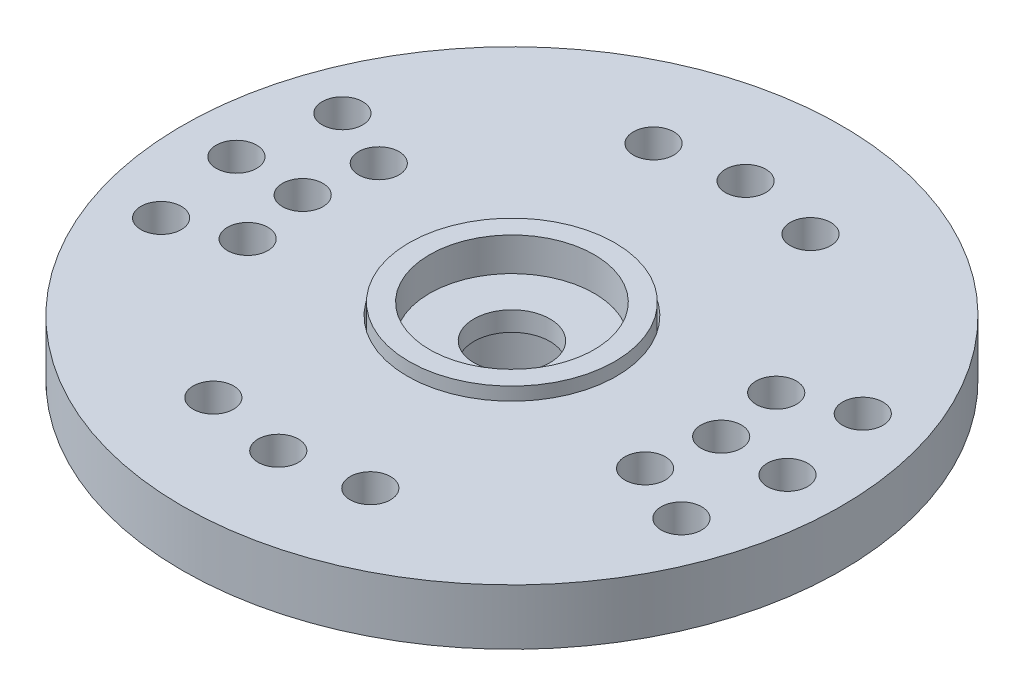
ISO-10303-21;
HEADER;
FILE_DESCRIPTION(('STEP AP214'),'2;1');
FILE_NAME('part.step','',(''),(''),'','','');
FILE_SCHEMA(('AUTOMOTIVE_DESIGN { 1 0 10303 214 1 1 1 1 }'));
ENDSEC;
DATA;
#1=APPLICATION_CONTEXT('core data for automotive mechanical design processes');
#2=APPLICATION_PROTOCOL_DEFINITION('international standard','automotive_design',2000,#1);
#3=PRODUCT_CONTEXT('',#1,'mechanical');
#4=PRODUCT('Part','Part','',(#3));
#5=PRODUCT_RELATED_PRODUCT_CATEGORY('part','',(#4));
#6=PRODUCT_DEFINITION_FORMATION('','',#4);
#7=PRODUCT_DEFINITION_CONTEXT('part definition',#1,'design');
#8=PRODUCT_DEFINITION('design','',#6,#7);
#9=PRODUCT_DEFINITION_SHAPE('','',#8);
#10=(LENGTH_UNIT() NAMED_UNIT(*) SI_UNIT(.MILLI.,.METRE.));
#11=(NAMED_UNIT(*) PLANE_ANGLE_UNIT() SI_UNIT($,.RADIAN.));
#12=(NAMED_UNIT(*) SI_UNIT($,.STERADIAN.) SOLID_ANGLE_UNIT());
#13=UNCERTAINTY_MEASURE_WITH_UNIT(LENGTH_MEASURE(1.E-05),#10,'distance_accuracy_value','');
#14=(GEOMETRIC_REPRESENTATION_CONTEXT(3) GLOBAL_UNCERTAINTY_ASSIGNED_CONTEXT((#13)) GLOBAL_UNIT_ASSIGNED_CONTEXT((#10,
#11,#12)) REPRESENTATION_CONTEXT('',''));
#15=CARTESIAN_POINT('',(0.,0.,0.));
#16=DIRECTION('',(0.,0.,1.));
#17=DIRECTION('',(1.,0.,0.));
#18=AXIS2_PLACEMENT_3D('',#15,#16,#17);
#19=CARTESIAN_POINT('',(0.,0.,0.));
#20=DIRECTION('',(0.,1.,0.));
#21=DIRECTION('',(0.,0.,1.));
#22=AXIS2_PLACEMENT_3D('',#19,#20,#21);
#23=PLANE('',#22);
#24=CARTESIAN_POINT('',(10.033,0.,0.));
#25=DIRECTION('',(0.,1.,0.));
#26=DIRECTION('',(0.,0.,1.));
#27=AXIS2_PLACEMENT_3D('',#24,#25,#26);
#28=CIRCLE('',#27,0.7366);
#29=CARTESIAN_POINT('',(10.033,0.,0.7366));
#30=VERTEX_POINT('',#29);
#31=EDGE_CURVE('E145',#30,#30,#28,.T.);
#32=ORIENTED_EDGE('',*,*,#31,.T.);
#33=EDGE_LOOP('',(#32));
#34=FACE_BOUND('',#33,.T.);
#35=CARTESIAN_POINT('',(-9.4740638059916,0.,-3.302));
#36=DIRECTION('',(0.,1.,0.));
#37=DIRECTION('',(0.,0.,-1.));
#38=AXIS2_PLACEMENT_3D('',#35,#36,#37);
#39=CIRCLE('',#38,0.7366);
#40=CARTESIAN_POINT('',(-9.4740638059916,0.,-4.0386));
#41=VERTEX_POINT('',#40);
#42=EDGE_CURVE('E133',#41,#41,#39,.T.);
#43=ORIENTED_EDGE('',*,*,#42,.T.);
#44=EDGE_LOOP('',(#43));
#45=FACE_BOUND('',#44,.T.);
#46=CARTESIAN_POINT('',(-7.23628124384341,0.,2.3876));
#47=DIRECTION('',(0.,1.,0.));
#48=DIRECTION('',(0.,0.,-1.));
#49=AXIS2_PLACEMENT_3D('',#46,#47,#48);
#50=CIRCLE('',#49,0.736600000000001);
#51=CARTESIAN_POINT('',(-7.23628124384341,0.,1.651));
#52=VERTEX_POINT('',#51);
#53=EDGE_CURVE('E121',#52,#52,#50,.T.);
#54=ORIENTED_EDGE('',*,*,#53,.T.);
#55=EDGE_LOOP('',(#54));
#56=FACE_BOUND('',#55,.T.);
#57=CARTESIAN_POINT('',(9.4740638059916,0.,-3.302));
#58=DIRECTION('',(0.,1.,0.));
#59=DIRECTION('',(0.,0.,1.));
#60=AXIS2_PLACEMENT_3D('',#57,#58,#59);
#61=CIRCLE('',#60,0.736599999999998);
#62=CARTESIAN_POINT('',(9.4740638059916,0.,-2.5654));
#63=VERTEX_POINT('',#62);
#64=EDGE_CURVE('E109',#63,#63,#61,.T.);
#65=ORIENTED_EDGE('',*,*,#64,.T.);
#66=EDGE_LOOP('',(#65));
#67=FACE_BOUND('',#66,.T.);
#68=CARTESIAN_POINT('',(7.23628124384341,0.,-2.3876));
#69=DIRECTION('',(0.,1.,0.));
#70=DIRECTION('',(0.,0.,1.));
#71=AXIS2_PLACEMENT_3D('',#68,#69,#70);
#72=CIRCLE('',#71,0.736599999999999);
#73=CARTESIAN_POINT('',(7.23628124384341,0.,-1.651));
#74=VERTEX_POINT('',#73);
#75=EDGE_CURVE('E97',#74,#74,#72,.T.);
#76=ORIENTED_EDGE('',*,*,#75,.T.);
#77=EDGE_LOOP('',(#76));
#78=FACE_BOUND('',#77,.T.);
#79=CARTESIAN_POINT('',(-2.8575,0.,8.01484714451873));
#80=DIRECTION('',(0.,1.,0.));
#81=DIRECTION('',(0.,0.,-1.));
#82=AXIS2_PLACEMENT_3D('',#79,#80,#81);
#83=CIRCLE('',#82,0.7366);
#84=CARTESIAN_POINT('',(-2.8575,0.,7.27824714451873));
#85=VERTEX_POINT('',#84);
#86=EDGE_CURVE('E85',#85,#85,#83,.T.);
#87=ORIENTED_EDGE('',*,*,#86,.T.);
#88=EDGE_LOOP('',(#87));
#89=FACE_BOUND('',#88,.T.);
#90=CARTESIAN_POINT('',(2.8575,0.,8.01484714451873));
#91=DIRECTION('',(0.,1.,0.));
#92=DIRECTION('',(0.,0.,1.));
#93=AXIS2_PLACEMENT_3D('',#90,#91,#92);
#94=CIRCLE('',#93,0.7366);
#95=CARTESIAN_POINT('',(2.8575,0.,8.75144714451873));
#96=VERTEX_POINT('',#95);
#97=EDGE_CURVE('E73',#96,#96,#94,.T.);
#98=ORIENTED_EDGE('',*,*,#97,.T.);
#99=EDGE_LOOP('',(#98));
#100=FACE_BOUND('',#99,.T.);
#101=CARTESIAN_POINT('',(7.62,0.,0.));
#102=DIRECTION('',(0.,1.,0.));
#103=DIRECTION('',(0.,0.,1.));
#104=AXIS2_PLACEMENT_3D('',#101,#102,#103);
#105=CIRCLE('',#104,0.736599999999999);
#106=CARTESIAN_POINT('',(7.62,0.,0.736599999999999));
#107=VERTEX_POINT('',#106);
#108=EDGE_CURVE('E61',#107,#107,#105,.T.);
#109=ORIENTED_EDGE('',*,*,#108,.T.);
#110=EDGE_LOOP('',(#109));
#111=FACE_BOUND('',#110,.T.);
#112=CARTESIAN_POINT('',(0.,0.,-8.509));
#113=DIRECTION('',(0.,1.,0.));
#114=DIRECTION('',(0.,0.,-1.));
#115=AXIS2_PLACEMENT_3D('',#112,#113,#114);
#116=CIRCLE('',#115,0.7366);
#117=CARTESIAN_POINT('',(0.,0.,-9.2456));
#118=VERTEX_POINT('',#117);
#119=EDGE_CURVE('E49',#118,#118,#116,.T.);
#120=ORIENTED_EDGE('',*,*,#119,.T.);
#121=EDGE_LOOP('',(#120));
#122=FACE_BOUND('',#121,.T.);
#123=CARTESIAN_POINT('',(0.,0.,0.));
#124=DIRECTION('',(0.,1.,0.));
#125=DIRECTION('',(0.,0.,1.));
#126=AXIS2_PLACEMENT_3D('',#123,#124,#125);
#127=CIRCLE('',#126,12.0015);
#128=CARTESIAN_POINT('',(0.,0.,12.0015));
#129=VERTEX_POINT('',#128);
#130=EDGE_CURVE('E42',#129,#129,#127,.T.);
#131=ORIENTED_EDGE('',*,*,#130,.F.);
#132=EDGE_LOOP('',(#131));
#133=FACE_BOUND('',#132,.T.);
#134=CARTESIAN_POINT('',(0.,0.,8.509));
#135=DIRECTION('',(0.,1.,0.));
#136=DIRECTION('',(0.,0.,-1.));
#137=AXIS2_PLACEMENT_3D('',#134,#135,#136);
#138=CIRCLE('',#137,0.7366);
#139=CARTESIAN_POINT('',(0.,0.,7.7724));
#140=VERTEX_POINT('',#139);
#141=EDGE_CURVE('E55',#140,#140,#138,.T.);
#142=ORIENTED_EDGE('',*,*,#141,.T.);
#143=EDGE_LOOP('',(#142));
#144=FACE_BOUND('',#143,.T.);
#145=CARTESIAN_POINT('',(-7.62,0.,0.));
#146=DIRECTION('',(0.,1.,0.));
#147=DIRECTION('',(0.,0.,-1.));
#148=AXIS2_PLACEMENT_3D('',#145,#146,#147);
#149=CIRCLE('',#148,0.7366);
#150=CARTESIAN_POINT('',(-7.62,0.,-0.736599999999998));
#151=VERTEX_POINT('',#150);
#152=EDGE_CURVE('E67',#151,#151,#149,.T.);
#153=ORIENTED_EDGE('',*,*,#152,.T.);
#154=EDGE_LOOP('',(#153));
#155=FACE_BOUND('',#154,.T.);
#156=CARTESIAN_POINT('',(2.8575,0.,-8.01484714451873));
#157=DIRECTION('',(0.,1.,0.));
#158=DIRECTION('',(0.,0.,1.));
#159=AXIS2_PLACEMENT_3D('',#156,#157,#158);
#160=CIRCLE('',#159,0.7366);
#161=CARTESIAN_POINT('',(2.8575,0.,-7.27824714451873));
#162=VERTEX_POINT('',#161);
#163=EDGE_CURVE('E79',#162,#162,#160,.T.);
#164=ORIENTED_EDGE('',*,*,#163,.T.);
#165=EDGE_LOOP('',(#164));
#166=FACE_BOUND('',#165,.T.);
#167=CARTESIAN_POINT('',(-2.8575,0.,-8.01484714451873));
#168=DIRECTION('',(0.,1.,0.));
#169=DIRECTION('',(0.,0.,-1.));
#170=AXIS2_PLACEMENT_3D('',#167,#168,#169);
#171=CIRCLE('',#170,0.7366);
#172=CARTESIAN_POINT('',(-2.8575,0.,-8.75144714451873));
#173=VERTEX_POINT('',#172);
#174=EDGE_CURVE('E91',#173,#173,#171,.T.);
#175=ORIENTED_EDGE('',*,*,#174,.T.);
#176=EDGE_LOOP('',(#175));
#177=FACE_BOUND('',#176,.T.);
#178=CARTESIAN_POINT('',(7.23628124384341,0.,2.3876));
#179=DIRECTION('',(0.,1.,0.));
#180=DIRECTION('',(0.,0.,1.));
#181=AXIS2_PLACEMENT_3D('',#178,#179,#180);
#182=CIRCLE('',#181,0.736599999999999);
#183=CARTESIAN_POINT('',(7.23628124384341,0.,3.1242));
#184=VERTEX_POINT('',#183);
#185=EDGE_CURVE('E103',#184,#184,#182,.T.);
#186=ORIENTED_EDGE('',*,*,#185,.T.);
#187=EDGE_LOOP('',(#186));
#188=FACE_BOUND('',#187,.T.);
#189=CARTESIAN_POINT('',(9.4740638059916,0.,3.302));
#190=DIRECTION('',(0.,1.,0.));
#191=DIRECTION('',(0.,0.,1.));
#192=AXIS2_PLACEMENT_3D('',#189,#190,#191);
#193=CIRCLE('',#192,0.736599999999998);
#194=CARTESIAN_POINT('',(9.4740638059916,0.,4.0386));
#195=VERTEX_POINT('',#194);
#196=EDGE_CURVE('E115',#195,#195,#193,.T.);
#197=ORIENTED_EDGE('',*,*,#196,.T.);
#198=EDGE_LOOP('',(#197));
#199=FACE_BOUND('',#198,.T.);
#200=CARTESIAN_POINT('',(-9.4740638059916,0.,3.302));
#201=DIRECTION('',(0.,1.,0.));
#202=DIRECTION('',(0.,0.,-1.));
#203=AXIS2_PLACEMENT_3D('',#200,#201,#202);
#204=CIRCLE('',#203,0.7366);
#205=CARTESIAN_POINT('',(-9.4740638059916,0.,2.5654));
#206=VERTEX_POINT('',#205);
#207=EDGE_CURVE('E127',#206,#206,#204,.T.);
#208=ORIENTED_EDGE('',*,*,#207,.T.);
#209=EDGE_LOOP('',(#208));
#210=FACE_BOUND('',#209,.T.);
#211=CARTESIAN_POINT('',(-7.23628124384341,0.,-2.3876));
#212=DIRECTION('',(0.,1.,0.));
#213=DIRECTION('',(0.,0.,-1.));
#214=AXIS2_PLACEMENT_3D('',#211,#212,#213);
#215=CIRCLE('',#214,0.736600000000001);
#216=CARTESIAN_POINT('',(-7.23628124384341,0.,-3.1242));
#217=VERTEX_POINT('',#216);
#218=EDGE_CURVE('E139',#217,#217,#215,.T.);
#219=ORIENTED_EDGE('',*,*,#218,.T.);
#220=EDGE_LOOP('',(#219));
#221=FACE_BOUND('',#220,.T.);
#222=CARTESIAN_POINT('',(-10.033,0.,0.));
#223=DIRECTION('',(0.,1.,0.));
#224=DIRECTION('',(0.,0.,1.));
#225=AXIS2_PLACEMENT_3D('',#222,#223,#224);
#226=CIRCLE('',#225,0.7366);
#227=CARTESIAN_POINT('',(-10.033,0.,0.7366));
#228=VERTEX_POINT('',#227);
#229=EDGE_CURVE('E151',#228,#228,#226,.T.);
#230=ORIENTED_EDGE('',*,*,#229,.T.);
#231=EDGE_LOOP('',(#230));
#232=FACE_BOUND('',#231,.T.);
#233=CARTESIAN_POINT('',(0.,0.,0.));
#234=DIRECTION('',(0.,1.,0.));
#235=DIRECTION('',(0.,0.,1.));
#236=AXIS2_PLACEMENT_3D('',#233,#234,#235);
#237=CIRCLE('',#236,4.445);
#238=CARTESIAN_POINT('',(0.,0.,4.445));
#239=VERTEX_POINT('',#238);
#240=EDGE_CURVE('E10',#239,#239,#237,.F.);
#241=ORIENTED_EDGE('',*,*,#240,.F.);
#242=EDGE_LOOP('',(#241));
#243=FACE_BOUND('',#242,.T.);
#244=ADVANCED_FACE('F31',(#34,#45,#56,#67,#78,#89,#100,#111,#122,#133,#144,#155,#166,#177,#188,
#199,#210,#221,#232,#243),#23,.F.);
#245=CARTESIAN_POINT('',(0.,2.032,0.));
#246=DIRECTION('',(0.,1.,0.));
#247=DIRECTION('',(0.,0.,1.));
#248=AXIS2_PLACEMENT_3D('',#245,#246,#247);
#249=PLANE('',#248);
#250=CARTESIAN_POINT('',(-10.033,2.032,0.));
#251=DIRECTION('',(0.,1.,0.));
#252=DIRECTION('',(0.,0.,1.));
#253=AXIS2_PLACEMENT_3D('',#250,#251,#252);
#254=CIRCLE('',#253,0.7366);
#255=CARTESIAN_POINT('',(-10.033,2.032,0.7366));
#256=VERTEX_POINT('',#255);
#257=EDGE_CURVE('E148',#256,#256,#254,.T.);
#258=ORIENTED_EDGE('',*,*,#257,.F.);
#259=EDGE_LOOP('',(#258));
#260=FACE_BOUND('',#259,.T.);
#261=CARTESIAN_POINT('',(-7.23628124384341,2.032,-2.3876));
#262=DIRECTION('',(0.,1.,0.));
#263=DIRECTION('',(0.,0.,-1.));
#264=AXIS2_PLACEMENT_3D('',#261,#262,#263);
#265=CIRCLE('',#264,0.736600000000001);
#266=CARTESIAN_POINT('',(-7.23628124384341,2.032,-3.1242));
#267=VERTEX_POINT('',#266);
#268=EDGE_CURVE('E136',#267,#267,#265,.T.);
#269=ORIENTED_EDGE('',*,*,#268,.F.);
#270=EDGE_LOOP('',(#269));
#271=FACE_BOUND('',#270,.T.);
#272=CARTESIAN_POINT('',(-9.4740638059916,2.032,3.302));
#273=DIRECTION('',(0.,1.,0.));
#274=DIRECTION('',(0.,0.,-1.));
#275=AXIS2_PLACEMENT_3D('',#272,#273,#274);
#276=CIRCLE('',#275,0.7366);
#277=CARTESIAN_POINT('',(-9.4740638059916,2.032,2.5654));
#278=VERTEX_POINT('',#277);
#279=EDGE_CURVE('E124',#278,#278,#276,.T.);
#280=ORIENTED_EDGE('',*,*,#279,.F.);
#281=EDGE_LOOP('',(#280));
#282=FACE_BOUND('',#281,.T.);
#283=CARTESIAN_POINT('',(9.4740638059916,2.032,3.302));
#284=DIRECTION('',(0.,1.,0.));
#285=DIRECTION('',(0.,0.,1.));
#286=AXIS2_PLACEMENT_3D('',#283,#284,#285);
#287=CIRCLE('',#286,0.736599999999998);
#288=CARTESIAN_POINT('',(9.4740638059916,2.032,4.0386));
#289=VERTEX_POINT('',#288);
#290=EDGE_CURVE('E112',#289,#289,#287,.T.);
#291=ORIENTED_EDGE('',*,*,#290,.F.);
#292=EDGE_LOOP('',(#291));
#293=FACE_BOUND('',#292,.T.);
#294=CARTESIAN_POINT('',(7.23628124384341,2.032,2.3876));
#295=DIRECTION('',(0.,1.,0.));
#296=DIRECTION('',(0.,0.,1.));
#297=AXIS2_PLACEMENT_3D('',#294,#295,#296);
#298=CIRCLE('',#297,0.736599999999999);
#299=CARTESIAN_POINT('',(7.23628124384341,2.032,3.1242));
#300=VERTEX_POINT('',#299);
#301=EDGE_CURVE('E100',#300,#300,#298,.T.);
#302=ORIENTED_EDGE('',*,*,#301,.F.);
#303=EDGE_LOOP('',(#302));
#304=FACE_BOUND('',#303,.T.);
#305=CARTESIAN_POINT('',(-2.8575,2.032,-8.01484714451873));
#306=DIRECTION('',(0.,1.,0.));
#307=DIRECTION('',(0.,0.,-1.));
#308=AXIS2_PLACEMENT_3D('',#305,#306,#307);
#309=CIRCLE('',#308,0.7366);
#310=CARTESIAN_POINT('',(-2.8575,2.032,-8.75144714451873));
#311=VERTEX_POINT('',#310);
#312=EDGE_CURVE('E88',#311,#311,#309,.T.);
#313=ORIENTED_EDGE('',*,*,#312,.F.);
#314=EDGE_LOOP('',(#313));
#315=FACE_BOUND('',#314,.T.);
#316=CARTESIAN_POINT('',(2.8575,2.032,-8.01484714451873));
#317=DIRECTION('',(0.,1.,0.));
#318=DIRECTION('',(0.,0.,1.));
#319=AXIS2_PLACEMENT_3D('',#316,#317,#318);
#320=CIRCLE('',#319,0.7366);
#321=CARTESIAN_POINT('',(2.8575,2.032,-7.27824714451873));
#322=VERTEX_POINT('',#321);
#323=EDGE_CURVE('E76',#322,#322,#320,.T.);
#324=ORIENTED_EDGE('',*,*,#323,.F.);
#325=EDGE_LOOP('',(#324));
#326=FACE_BOUND('',#325,.T.);
#327=CARTESIAN_POINT('',(-7.62,2.032,0.));
#328=DIRECTION('',(0.,1.,0.));
#329=DIRECTION('',(0.,0.,-1.));
#330=AXIS2_PLACEMENT_3D('',#327,#328,#329);
#331=CIRCLE('',#330,0.7366);
#332=CARTESIAN_POINT('',(-7.62,2.032,-0.736599999999998));
#333=VERTEX_POINT('',#332);
#334=EDGE_CURVE('E64',#333,#333,#331,.T.);
#335=ORIENTED_EDGE('',*,*,#334,.F.);
#336=EDGE_LOOP('',(#335));
#337=FACE_BOUND('',#336,.T.);
#338=CARTESIAN_POINT('',(0.,2.032,8.509));
#339=DIRECTION('',(0.,1.,0.));
#340=DIRECTION('',(0.,0.,-1.));
#341=AXIS2_PLACEMENT_3D('',#338,#339,#340);
#342=CIRCLE('',#341,0.7366);
#343=CARTESIAN_POINT('',(0.,2.032,7.7724));
#344=VERTEX_POINT('',#343);
#345=EDGE_CURVE('E52',#344,#344,#342,.T.);
#346=ORIENTED_EDGE('',*,*,#345,.F.);
#347=EDGE_LOOP('',(#346));
#348=FACE_BOUND('',#347,.T.);
#349=CARTESIAN_POINT('',(0.,2.032,0.));
#350=DIRECTION('',(0.,1.,0.));
#351=DIRECTION('',(0.,0.,1.));
#352=AXIS2_PLACEMENT_3D('',#349,#350,#351);
#353=CIRCLE('',#352,12.0015);
#354=CARTESIAN_POINT('',(0.,2.032,12.0015));
#355=VERTEX_POINT('',#354);
#356=EDGE_CURVE('E38',#355,#355,#353,.T.);
#357=ORIENTED_EDGE('',*,*,#356,.T.);
#358=EDGE_LOOP('',(#357));
#359=FACE_BOUND('',#358,.T.);
#360=CARTESIAN_POINT('',(0.,2.032,-8.509));
#361=DIRECTION('',(0.,1.,0.));
#362=DIRECTION('',(0.,0.,-1.));
#363=AXIS2_PLACEMENT_3D('',#360,#361,#362);
#364=CIRCLE('',#363,0.7366);
#365=CARTESIAN_POINT('',(0.,2.032,-9.2456));
#366=VERTEX_POINT('',#365);
#367=EDGE_CURVE('E47',#366,#366,#364,.T.);
#368=ORIENTED_EDGE('',*,*,#367,.F.);
#369=EDGE_LOOP('',(#368));
#370=FACE_BOUND('',#369,.T.);
#371=CARTESIAN_POINT('',(7.62,2.032,0.));
#372=DIRECTION('',(0.,1.,0.));
#373=DIRECTION('',(0.,0.,1.));
#374=AXIS2_PLACEMENT_3D('',#371,#372,#373);
#375=CIRCLE('',#374,0.736599999999999);
#376=CARTESIAN_POINT('',(7.62,2.032,0.736599999999999));
#377=VERTEX_POINT('',#376);
#378=EDGE_CURVE('E58',#377,#377,#375,.T.);
#379=ORIENTED_EDGE('',*,*,#378,.F.);
#380=EDGE_LOOP('',(#379));
#381=FACE_BOUND('',#380,.T.);
#382=CARTESIAN_POINT('',(2.8575,2.032,8.01484714451873));
#383=DIRECTION('',(0.,1.,0.));
#384=DIRECTION('',(0.,0.,1.));
#385=AXIS2_PLACEMENT_3D('',#382,#383,#384);
#386=CIRCLE('',#385,0.7366);
#387=CARTESIAN_POINT('',(2.8575,2.032,8.75144714451873));
#388=VERTEX_POINT('',#387);
#389=EDGE_CURVE('E70',#388,#388,#386,.T.);
#390=ORIENTED_EDGE('',*,*,#389,.F.);
#391=EDGE_LOOP('',(#390));
#392=FACE_BOUND('',#391,.T.);
#393=CARTESIAN_POINT('',(-2.8575,2.032,8.01484714451873));
#394=DIRECTION('',(0.,1.,0.));
#395=DIRECTION('',(0.,0.,-1.));
#396=AXIS2_PLACEMENT_3D('',#393,#394,#395);
#397=CIRCLE('',#396,0.7366);
#398=CARTESIAN_POINT('',(-2.8575,2.032,7.27824714451873));
#399=VERTEX_POINT('',#398);
#400=EDGE_CURVE('E82',#399,#399,#397,.T.);
#401=ORIENTED_EDGE('',*,*,#400,.F.);
#402=EDGE_LOOP('',(#401));
#403=FACE_BOUND('',#402,.T.);
#404=CARTESIAN_POINT('',(7.23628124384341,2.032,-2.3876));
#405=DIRECTION('',(0.,1.,0.));
#406=DIRECTION('',(0.,0.,1.));
#407=AXIS2_PLACEMENT_3D('',#404,#405,#406);
#408=CIRCLE('',#407,0.736599999999999);
#409=CARTESIAN_POINT('',(7.23628124384341,2.032,-1.651));
#410=VERTEX_POINT('',#409);
#411=EDGE_CURVE('E94',#410,#410,#408,.T.);
#412=ORIENTED_EDGE('',*,*,#411,.F.);
#413=EDGE_LOOP('',(#412));
#414=FACE_BOUND('',#413,.T.);
#415=CARTESIAN_POINT('',(9.4740638059916,2.032,-3.302));
#416=DIRECTION('',(0.,1.,0.));
#417=DIRECTION('',(0.,0.,1.));
#418=AXIS2_PLACEMENT_3D('',#415,#416,#417);
#419=CIRCLE('',#418,0.736599999999998);
#420=CARTESIAN_POINT('',(9.4740638059916,2.032,-2.5654));
#421=VERTEX_POINT('',#420);
#422=EDGE_CURVE('E106',#421,#421,#419,.T.);
#423=ORIENTED_EDGE('',*,*,#422,.F.);
#424=EDGE_LOOP('',(#423));
#425=FACE_BOUND('',#424,.T.);
#426=CARTESIAN_POINT('',(-7.23628124384341,2.032,2.3876));
#427=DIRECTION('',(0.,1.,0.));
#428=DIRECTION('',(0.,0.,-1.));
#429=AXIS2_PLACEMENT_3D('',#426,#427,#428);
#430=CIRCLE('',#429,0.736600000000001);
#431=CARTESIAN_POINT('',(-7.23628124384341,2.032,1.651));
#432=VERTEX_POINT('',#431);
#433=EDGE_CURVE('E118',#432,#432,#430,.T.);
#434=ORIENTED_EDGE('',*,*,#433,.F.);
#435=EDGE_LOOP('',(#434));
#436=FACE_BOUND('',#435,.T.);
#437=CARTESIAN_POINT('',(-9.4740638059916,2.032,-3.302));
#438=DIRECTION('',(0.,1.,0.));
#439=DIRECTION('',(0.,0.,-1.));
#440=AXIS2_PLACEMENT_3D('',#437,#438,#439);
#441=CIRCLE('',#440,0.7366);
#442=CARTESIAN_POINT('',(-9.4740638059916,2.032,-4.0386));
#443=VERTEX_POINT('',#442);
#444=EDGE_CURVE('E130',#443,#443,#441,.T.);
#445=ORIENTED_EDGE('',*,*,#444,.F.);
#446=EDGE_LOOP('',(#445));
#447=FACE_BOUND('',#446,.T.);
#448=CARTESIAN_POINT('',(10.033,2.032,0.));
#449=DIRECTION('',(0.,1.,0.));
#450=DIRECTION('',(0.,0.,1.));
#451=AXIS2_PLACEMENT_3D('',#448,#449,#450);
#452=CIRCLE('',#451,0.7366);
#453=CARTESIAN_POINT('',(10.033,2.032,0.7366));
#454=VERTEX_POINT('',#453);
#455=EDGE_CURVE('E142',#454,#454,#452,.T.);
#456=ORIENTED_EDGE('',*,*,#455,.F.);
#457=EDGE_LOOP('',(#456));
#458=FACE_BOUND('',#457,.T.);
#459=CARTESIAN_POINT('',(0.,2.032,0.));
#460=DIRECTION('',(0.,1.,0.));
#461=DIRECTION('',(0.,0.,1.));
#462=AXIS2_PLACEMENT_3D('',#459,#460,#461);
#463=CIRCLE('',#462,3.81);
#464=CARTESIAN_POINT('',(0.,2.032,3.81));
#465=VERTEX_POINT('',#464);
#466=EDGE_CURVE('E154',#465,#465,#463,.T.);
#467=ORIENTED_EDGE('',*,*,#466,.F.);
#468=EDGE_LOOP('',(#467));
#469=FACE_BOUND('',#468,.T.);
#470=ADVANCED_FACE('F239',(#260,#271,#282,#293,#304,#315,#326,#337,#348,#359,#370,#381,#392,
#403,#414,#425,#436,#447,#458,#469),#249,.T.);
#471=CARTESIAN_POINT('',(0.,2.032,0.));
#472=DIRECTION('',(0.,-1.,0.));
#473=DIRECTION('',(0.,0.,-1.));
#474=AXIS2_PLACEMENT_3D('',#471,#472,#473);
#475=CYLINDRICAL_SURFACE('',#474,12.0015);
#476=ORIENTED_EDGE('',*,*,#356,.F.);
#477=EDGE_LOOP('',(#476));
#478=FACE_BOUND('',#477,.T.);
#479=ORIENTED_EDGE('',*,*,#130,.T.);
#480=EDGE_LOOP('',(#479));
#481=FACE_BOUND('',#480,.T.);
#482=ADVANCED_FACE('F33',(#478,#481),#475,.T.);
#483=CARTESIAN_POINT('',(0.,2.032,-8.509));
#484=DIRECTION('',(0.,-1.,0.));
#485=DIRECTION('',(0.,0.,-1.));
#486=AXIS2_PLACEMENT_3D('',#483,#484,#485);
#487=CYLINDRICAL_SURFACE('',#486,0.7366);
#488=ORIENTED_EDGE('',*,*,#367,.T.);
#489=EDGE_LOOP('',(#488));
#490=FACE_BOUND('',#489,.T.);
#491=ORIENTED_EDGE('',*,*,#119,.F.);
#492=EDGE_LOOP('',(#491));
#493=FACE_BOUND('',#492,.T.);
#494=ADVANCED_FACE('F248',(#490,#493),#487,.F.);
#495=CARTESIAN_POINT('',(0.,2.032,8.509));
#496=DIRECTION('',(0.,-1.,0.));
#497=DIRECTION('',(0.,0.,-1.));
#498=AXIS2_PLACEMENT_3D('',#495,#496,#497);
#499=CYLINDRICAL_SURFACE('',#498,0.7366);
#500=ORIENTED_EDGE('',*,*,#345,.T.);
#501=EDGE_LOOP('',(#500));
#502=FACE_BOUND('',#501,.T.);
#503=ORIENTED_EDGE('',*,*,#141,.F.);
#504=EDGE_LOOP('',(#503));
#505=FACE_BOUND('',#504,.T.);
#506=ADVANCED_FACE('F251',(#502,#505),#499,.F.);
#507=CARTESIAN_POINT('',(7.62,2.032,0.));
#508=DIRECTION('',(0.,-1.,0.));
#509=DIRECTION('',(0.,0.,-1.));
#510=AXIS2_PLACEMENT_3D('',#507,#508,#509);
#511=CYLINDRICAL_SURFACE('',#510,0.736599999999999);
#512=ORIENTED_EDGE('',*,*,#378,.T.);
#513=EDGE_LOOP('',(#512));
#514=FACE_BOUND('',#513,.T.);
#515=ORIENTED_EDGE('',*,*,#108,.F.);
#516=EDGE_LOOP('',(#515));
#517=FACE_BOUND('',#516,.T.);
#518=ADVANCED_FACE('F255',(#514,#517),#511,.F.);
#519=CARTESIAN_POINT('',(-7.62,2.032,0.));
#520=DIRECTION('',(0.,-1.,0.));
#521=DIRECTION('',(0.,0.,-1.));
#522=AXIS2_PLACEMENT_3D('',#519,#520,#521);
#523=CYLINDRICAL_SURFACE('',#522,0.7366);
#524=ORIENTED_EDGE('',*,*,#334,.T.);
#525=EDGE_LOOP('',(#524));
#526=FACE_BOUND('',#525,.T.);
#527=ORIENTED_EDGE('',*,*,#152,.F.);
#528=EDGE_LOOP('',(#527));
#529=FACE_BOUND('',#528,.T.);
#530=ADVANCED_FACE('F259',(#526,#529),#523,.F.);
#531=CARTESIAN_POINT('',(2.8575,2.032,8.01484714451873));
#532=DIRECTION('',(0.,-1.,0.));
#533=DIRECTION('',(0.,0.,-1.));
#534=AXIS2_PLACEMENT_3D('',#531,#532,#533);
#535=CYLINDRICAL_SURFACE('',#534,0.7366);
#536=ORIENTED_EDGE('',*,*,#389,.T.);
#537=EDGE_LOOP('',(#536));
#538=FACE_BOUND('',#537,.T.);
#539=ORIENTED_EDGE('',*,*,#97,.F.);
#540=EDGE_LOOP('',(#539));
#541=FACE_BOUND('',#540,.T.);
#542=ADVANCED_FACE('F263',(#538,#541),#535,.F.);
#543=CARTESIAN_POINT('',(2.8575,2.032,-8.01484714451873));
#544=DIRECTION('',(0.,-1.,0.));
#545=DIRECTION('',(0.,0.,-1.));
#546=AXIS2_PLACEMENT_3D('',#543,#544,#545);
#547=CYLINDRICAL_SURFACE('',#546,0.7366);
#548=ORIENTED_EDGE('',*,*,#323,.T.);
#549=EDGE_LOOP('',(#548));
#550=FACE_BOUND('',#549,.T.);
#551=ORIENTED_EDGE('',*,*,#163,.F.);
#552=EDGE_LOOP('',(#551));
#553=FACE_BOUND('',#552,.T.);
#554=ADVANCED_FACE('F267',(#550,#553),#547,.F.);
#555=CARTESIAN_POINT('',(-2.8575,2.032,8.01484714451873));
#556=DIRECTION('',(0.,-1.,0.));
#557=DIRECTION('',(0.,0.,-1.));
#558=AXIS2_PLACEMENT_3D('',#555,#556,#557);
#559=CYLINDRICAL_SURFACE('',#558,0.7366);
#560=ORIENTED_EDGE('',*,*,#400,.T.);
#561=EDGE_LOOP('',(#560));
#562=FACE_BOUND('',#561,.T.);
#563=ORIENTED_EDGE('',*,*,#86,.F.);
#564=EDGE_LOOP('',(#563));
#565=FACE_BOUND('',#564,.T.);
#566=ADVANCED_FACE('F271',(#562,#565),#559,.F.);
#567=CARTESIAN_POINT('',(-2.8575,2.032,-8.01484714451873));
#568=DIRECTION('',(0.,-1.,0.));
#569=DIRECTION('',(0.,0.,-1.));
#570=AXIS2_PLACEMENT_3D('',#567,#568,#569);
#571=CYLINDRICAL_SURFACE('',#570,0.7366);
#572=ORIENTED_EDGE('',*,*,#312,.T.);
#573=EDGE_LOOP('',(#572));
#574=FACE_BOUND('',#573,.T.);
#575=ORIENTED_EDGE('',*,*,#174,.F.);
#576=EDGE_LOOP('',(#575));
#577=FACE_BOUND('',#576,.T.);
#578=ADVANCED_FACE('F275',(#574,#577),#571,.F.);
#579=CARTESIAN_POINT('',(7.23628124384341,2.032,-2.3876));
#580=DIRECTION('',(0.,-1.,0.));
#581=DIRECTION('',(0.,0.,-1.));
#582=AXIS2_PLACEMENT_3D('',#579,#580,#581);
#583=CYLINDRICAL_SURFACE('',#582,0.736599999999999);
#584=ORIENTED_EDGE('',*,*,#411,.T.);
#585=EDGE_LOOP('',(#584));
#586=FACE_BOUND('',#585,.T.);
#587=ORIENTED_EDGE('',*,*,#75,.F.);
#588=EDGE_LOOP('',(#587));
#589=FACE_BOUND('',#588,.T.);
#590=ADVANCED_FACE('F279',(#586,#589),#583,.F.);
#591=CARTESIAN_POINT('',(7.23628124384341,2.032,2.3876));
#592=DIRECTION('',(0.,-1.,0.));
#593=DIRECTION('',(0.,0.,-1.));
#594=AXIS2_PLACEMENT_3D('',#591,#592,#593);
#595=CYLINDRICAL_SURFACE('',#594,0.736599999999999);
#596=ORIENTED_EDGE('',*,*,#301,.T.);
#597=EDGE_LOOP('',(#596));
#598=FACE_BOUND('',#597,.T.);
#599=ORIENTED_EDGE('',*,*,#185,.F.);
#600=EDGE_LOOP('',(#599));
#601=FACE_BOUND('',#600,.T.);
#602=ADVANCED_FACE('F283',(#598,#601),#595,.F.);
#603=CARTESIAN_POINT('',(9.4740638059916,2.032,-3.302));
#604=DIRECTION('',(0.,-1.,0.));
#605=DIRECTION('',(0.,0.,-1.));
#606=AXIS2_PLACEMENT_3D('',#603,#604,#605);
#607=CYLINDRICAL_SURFACE('',#606,0.736599999999998);
#608=ORIENTED_EDGE('',*,*,#422,.T.);
#609=EDGE_LOOP('',(#608));
#610=FACE_BOUND('',#609,.T.);
#611=ORIENTED_EDGE('',*,*,#64,.F.);
#612=EDGE_LOOP('',(#611));
#613=FACE_BOUND('',#612,.T.);
#614=ADVANCED_FACE('F287',(#610,#613),#607,.F.);
#615=CARTESIAN_POINT('',(9.4740638059916,2.032,3.302));
#616=DIRECTION('',(0.,-1.,0.));
#617=DIRECTION('',(0.,0.,-1.));
#618=AXIS2_PLACEMENT_3D('',#615,#616,#617);
#619=CYLINDRICAL_SURFACE('',#618,0.736599999999998);
#620=ORIENTED_EDGE('',*,*,#290,.T.);
#621=EDGE_LOOP('',(#620));
#622=FACE_BOUND('',#621,.T.);
#623=ORIENTED_EDGE('',*,*,#196,.F.);
#624=EDGE_LOOP('',(#623));
#625=FACE_BOUND('',#624,.T.);
#626=ADVANCED_FACE('F291',(#622,#625),#619,.F.);
#627=CARTESIAN_POINT('',(-7.23628124384341,2.032,2.3876));
#628=DIRECTION('',(0.,-1.,0.));
#629=DIRECTION('',(0.,0.,-1.));
#630=AXIS2_PLACEMENT_3D('',#627,#628,#629);
#631=CYLINDRICAL_SURFACE('',#630,0.736600000000001);
#632=ORIENTED_EDGE('',*,*,#433,.T.);
#633=EDGE_LOOP('',(#632));
#634=FACE_BOUND('',#633,.T.);
#635=ORIENTED_EDGE('',*,*,#53,.F.);
#636=EDGE_LOOP('',(#635));
#637=FACE_BOUND('',#636,.T.);
#638=ADVANCED_FACE('F295',(#634,#637),#631,.F.);
#639=CARTESIAN_POINT('',(-9.4740638059916,2.032,3.302));
#640=DIRECTION('',(0.,-1.,0.));
#641=DIRECTION('',(0.,0.,-1.));
#642=AXIS2_PLACEMENT_3D('',#639,#640,#641);
#643=CYLINDRICAL_SURFACE('',#642,0.7366);
#644=ORIENTED_EDGE('',*,*,#279,.T.);
#645=EDGE_LOOP('',(#644));
#646=FACE_BOUND('',#645,.T.);
#647=ORIENTED_EDGE('',*,*,#207,.F.);
#648=EDGE_LOOP('',(#647));
#649=FACE_BOUND('',#648,.T.);
#650=ADVANCED_FACE('F299',(#646,#649),#643,.F.);
#651=CARTESIAN_POINT('',(-9.4740638059916,2.032,-3.302));
#652=DIRECTION('',(0.,-1.,0.));
#653=DIRECTION('',(0.,0.,-1.));
#654=AXIS2_PLACEMENT_3D('',#651,#652,#653);
#655=CYLINDRICAL_SURFACE('',#654,0.7366);
#656=ORIENTED_EDGE('',*,*,#444,.T.);
#657=EDGE_LOOP('',(#656));
#658=FACE_BOUND('',#657,.T.);
#659=ORIENTED_EDGE('',*,*,#42,.F.);
#660=EDGE_LOOP('',(#659));
#661=FACE_BOUND('',#660,.T.);
#662=ADVANCED_FACE('F303',(#658,#661),#655,.F.);
#663=CARTESIAN_POINT('',(-7.23628124384341,2.032,-2.3876));
#664=DIRECTION('',(0.,-1.,0.));
#665=DIRECTION('',(0.,0.,-1.));
#666=AXIS2_PLACEMENT_3D('',#663,#664,#665);
#667=CYLINDRICAL_SURFACE('',#666,0.736600000000001);
#668=ORIENTED_EDGE('',*,*,#268,.T.);
#669=EDGE_LOOP('',(#668));
#670=FACE_BOUND('',#669,.T.);
#671=ORIENTED_EDGE('',*,*,#218,.F.);
#672=EDGE_LOOP('',(#671));
#673=FACE_BOUND('',#672,.T.);
#674=ADVANCED_FACE('F307',(#670,#673),#667,.F.);
#675=CARTESIAN_POINT('',(10.033,2.032,0.));
#676=DIRECTION('',(0.,-1.,0.));
#677=DIRECTION('',(0.,0.,-1.));
#678=AXIS2_PLACEMENT_3D('',#675,#676,#677);
#679=CYLINDRICAL_SURFACE('',#678,0.7366);
#680=ORIENTED_EDGE('',*,*,#455,.T.);
#681=EDGE_LOOP('',(#680));
#682=FACE_BOUND('',#681,.T.);
#683=ORIENTED_EDGE('',*,*,#31,.F.);
#684=EDGE_LOOP('',(#683));
#685=FACE_BOUND('',#684,.T.);
#686=ADVANCED_FACE('F311',(#682,#685),#679,.F.);
#687=CARTESIAN_POINT('',(-10.033,2.032,0.));
#688=DIRECTION('',(0.,-1.,0.));
#689=DIRECTION('',(0.,0.,-1.));
#690=AXIS2_PLACEMENT_3D('',#687,#688,#689);
#691=CYLINDRICAL_SURFACE('',#690,0.7366);
#692=ORIENTED_EDGE('',*,*,#257,.T.);
#693=EDGE_LOOP('',(#692));
#694=FACE_BOUND('',#693,.T.);
#695=ORIENTED_EDGE('',*,*,#229,.F.);
#696=EDGE_LOOP('',(#695));
#697=FACE_BOUND('',#696,.T.);
#698=ADVANCED_FACE('F315',(#694,#697),#691,.F.);
#699=CARTESIAN_POINT('',(0.,2.032,0.));
#700=DIRECTION('',(0.,-1.,0.));
#701=DIRECTION('',(0.,0.,-1.));
#702=AXIS2_PLACEMENT_3D('',#699,#700,#701);
#703=CYLINDRICAL_SURFACE('',#702,3.81);
#704=ORIENTED_EDGE('',*,*,#466,.T.);
#705=EDGE_LOOP('',(#704));
#706=FACE_BOUND('',#705,.T.);
#707=CARTESIAN_POINT('',(0.,0.,0.));
#708=DIRECTION('',(0.,1.,0.));
#709=DIRECTION('',(0.,0.,1.));
#710=AXIS2_PLACEMENT_3D('',#707,#708,#709);
#711=CIRCLE('',#710,3.81);
#712=CARTESIAN_POINT('',(0.,0.,3.81));
#713=VERTEX_POINT('',#712);
#714=EDGE_CURVE('E157',#713,#713,#711,.T.);
#715=ORIENTED_EDGE('',*,*,#714,.F.);
#716=EDGE_LOOP('',(#715));
#717=FACE_BOUND('',#716,.T.);
#718=ADVANCED_FACE('F319',(#706,#717),#703,.F.);
#719=CARTESIAN_POINT('',(0.,2.4638,0.));
#720=DIRECTION('',(0.,1.,0.));
#721=DIRECTION('',(-1.,0.,0.));
#722=AXIS2_PLACEMENT_3D('',#719,#720,#721);
#723=CYLINDRICAL_SURFACE('',#722,2.794);
#724=CARTESIAN_POINT('',(0.,-2.5146,0.));
#725=DIRECTION('',(0.,1.,0.));
#726=DIRECTION('',(-1.,0.,0.));
#727=AXIS2_PLACEMENT_3D('',#724,#725,#726);
#728=CIRCLE('',#727,2.794);
#729=CARTESIAN_POINT('',(-2.794,-2.5146,0.));
#730=VERTEX_POINT('',#729);
#731=EDGE_CURVE('E160',#730,#730,#728,.T.);
#732=ORIENTED_EDGE('',*,*,#731,.F.);
#733=EDGE_LOOP('',(#732));
#734=FACE_BOUND('',#733,.T.);
#735=CARTESIAN_POINT('',(0.,0.533399999999999,0.));
#736=DIRECTION('',(0.,1.,0.));
#737=DIRECTION('',(-1.,0.,0.));
#738=AXIS2_PLACEMENT_3D('',#735,#736,#737);
#739=CIRCLE('',#738,2.794);
#740=CARTESIAN_POINT('',(-2.794,0.533399999999999,0.));
#741=VERTEX_POINT('',#740);
#742=EDGE_CURVE('E186',#741,#741,#739,.T.);
#743=ORIENTED_EDGE('',*,*,#742,.T.);
#744=EDGE_LOOP('',(#743));
#745=FACE_BOUND('',#744,.T.);
#746=ADVANCED_FACE('F190',(#734,#745),#723,.F.);
#747=CARTESIAN_POINT('',(2.794,-2.5146,0.));
#748=DIRECTION('',(0.,1.,0.));
#749=DIRECTION('',(-1.,0.,0.));
#750=AXIS2_PLACEMENT_3D('',#747,#748,#749);
#751=PLANE('',#750);
#752=CARTESIAN_POINT('',(0.,-2.5146,0.));
#753=DIRECTION('',(0.,1.,0.));
#754=DIRECTION('',(-1.,0.,0.));
#755=AXIS2_PLACEMENT_3D('',#752,#753,#754);
#756=CIRCLE('',#755,4.445);
#757=CARTESIAN_POINT('',(-4.445,-2.5146,0.));
#758=VERTEX_POINT('',#757);
#759=EDGE_CURVE('E165',#758,#758,#756,.T.);
#760=ORIENTED_EDGE('',*,*,#759,.F.);
#761=EDGE_LOOP('',(#760));
#762=FACE_BOUND('',#761,.T.);
#763=ORIENTED_EDGE('',*,*,#731,.T.);
#764=EDGE_LOOP('',(#763));
#765=FACE_BOUND('',#764,.T.);
#766=ADVANCED_FACE('F236',(#762,#765),#751,.F.);
#767=CARTESIAN_POINT('',(0.,2.4638,0.));
#768=DIRECTION('',(0.,1.,0.));
#769=DIRECTION('',(-1.,0.,0.));
#770=AXIS2_PLACEMENT_3D('',#767,#768,#769);
#771=CYLINDRICAL_SURFACE('',#770,4.445);
#772=ORIENTED_EDGE('',*,*,#240,.T.);
#773=EDGE_LOOP('',(#772));
#774=FACE_BOUND('',#773,.T.);
#775=ORIENTED_EDGE('',*,*,#759,.T.);
#776=EDGE_LOOP('',(#775));
#777=FACE_BOUND('',#776,.T.);
#778=ADVANCED_FACE('F230',(#774,#777),#771,.T.);
#779=CARTESIAN_POINT('',(3.7465,0.,0.));
#780=DIRECTION('',(0.,-1.,0.));
#781=DIRECTION('',(1.,0.,0.));
#782=AXIS2_PLACEMENT_3D('',#779,#780,#781);
#783=PLANE('',#782);
#784=ORIENTED_EDGE('',*,*,#714,.T.);
#785=EDGE_LOOP('',(#784));
#786=FACE_BOUND('',#785,.T.);
#787=CARTESIAN_POINT('',(0.,0.,0.));
#788=DIRECTION('',(0.,1.,0.));
#789=DIRECTION('',(-1.,0.,0.));
#790=AXIS2_PLACEMENT_3D('',#787,#788,#789);
#791=CIRCLE('',#790,3.7465);
#792=CARTESIAN_POINT('',(-3.7465,0.,0.));
#793=VERTEX_POINT('',#792);
#794=EDGE_CURVE('E168',#793,#793,#791,.T.);
#795=ORIENTED_EDGE('',*,*,#794,.F.);
#796=EDGE_LOOP('',(#795));
#797=FACE_BOUND('',#796,.T.);
#798=ADVANCED_FACE('F225',(#786,#797),#783,.F.);
#799=CARTESIAN_POINT('',(0.,2.4638,0.));
#800=DIRECTION('',(0.,1.,0.));
#801=DIRECTION('',(-1.,0.,0.));
#802=AXIS2_PLACEMENT_3D('',#799,#800,#801);
#803=CYLINDRICAL_SURFACE('',#802,3.7465);
#804=CARTESIAN_POINT('',(0.,2.4638,0.));
#805=DIRECTION('',(0.,1.,0.));
#806=DIRECTION('',(-1.,0.,0.));
#807=AXIS2_PLACEMENT_3D('',#804,#805,#806);
#808=CIRCLE('',#807,3.7465);
#809=CARTESIAN_POINT('',(-3.7465,2.4638,0.));
#810=VERTEX_POINT('',#809);
#811=EDGE_CURVE('E171',#810,#810,#808,.T.);
#812=ORIENTED_EDGE('',*,*,#811,.F.);
#813=EDGE_LOOP('',(#812));
#814=FACE_BOUND('',#813,.T.);
#815=ORIENTED_EDGE('',*,*,#794,.T.);
#816=EDGE_LOOP('',(#815));
#817=FACE_BOUND('',#816,.T.);
#818=ADVANCED_FACE('F219',(#814,#817),#803,.T.);
#819=CARTESIAN_POINT('',(2.9972,2.4638,0.));
#820=DIRECTION('',(0.,-1.,0.));
#821=DIRECTION('',(1.,0.,0.));
#822=AXIS2_PLACEMENT_3D('',#819,#820,#821);
#823=PLANE('',#822);
#824=CARTESIAN_POINT('',(0.,2.4638,0.));
#825=DIRECTION('',(0.,1.,0.));
#826=DIRECTION('',(-1.,0.,0.));
#827=AXIS2_PLACEMENT_3D('',#824,#825,#826);
#828=CIRCLE('',#827,2.9972);
#829=CARTESIAN_POINT('',(-2.9972,2.4638,0.));
#830=VERTEX_POINT('',#829);
#831=EDGE_CURVE('E174',#830,#830,#828,.T.);
#832=ORIENTED_EDGE('',*,*,#831,.F.);
#833=EDGE_LOOP('',(#832));
#834=FACE_BOUND('',#833,.T.);
#835=ORIENTED_EDGE('',*,*,#811,.T.);
#836=EDGE_LOOP('',(#835));
#837=FACE_BOUND('',#836,.T.);
#838=ADVANCED_FACE('F213',(#834,#837),#823,.F.);
#839=CARTESIAN_POINT('',(0.,2.4638,0.));
#840=DIRECTION('',(0.,1.,0.));
#841=DIRECTION('',(-1.,0.,0.));
#842=AXIS2_PLACEMENT_3D('',#839,#840,#841);
#843=CYLINDRICAL_SURFACE('',#842,2.9972);
#844=CARTESIAN_POINT('',(0.,1.2446,0.));
#845=DIRECTION('',(0.,1.,0.));
#846=DIRECTION('',(-1.,0.,0.));
#847=AXIS2_PLACEMENT_3D('',#844,#845,#846);
#848=CIRCLE('',#847,2.9972);
#849=CARTESIAN_POINT('',(-2.9972,1.2446,0.));
#850=VERTEX_POINT('',#849);
#851=EDGE_CURVE('E177',#850,#850,#848,.T.);
#852=ORIENTED_EDGE('',*,*,#851,.F.);
#853=EDGE_LOOP('',(#852));
#854=FACE_BOUND('',#853,.T.);
#855=ORIENTED_EDGE('',*,*,#831,.T.);
#856=EDGE_LOOP('',(#855));
#857=FACE_BOUND('',#856,.T.);
#858=ADVANCED_FACE('F207',(#854,#857),#843,.F.);
#859=CARTESIAN_POINT('',(2.9972,1.2446,0.));
#860=DIRECTION('',(0.,-1.,0.));
#861=DIRECTION('',(1.,0.,0.));
#862=AXIS2_PLACEMENT_3D('',#859,#860,#861);
#863=PLANE('',#862);
#864=CARTESIAN_POINT('',(0.,1.2446,0.));
#865=DIRECTION('',(0.,1.,0.));
#866=DIRECTION('',(-1.,0.,0.));
#867=AXIS2_PLACEMENT_3D('',#864,#865,#866);
#868=CIRCLE('',#867,1.3843);
#869=CARTESIAN_POINT('',(-1.3843,1.2446,0.));
#870=VERTEX_POINT('',#869);
#871=EDGE_CURVE('E180',#870,#870,#868,.T.);
#872=ORIENTED_EDGE('',*,*,#871,.F.);
#873=EDGE_LOOP('',(#872));
#874=FACE_BOUND('',#873,.T.);
#875=ORIENTED_EDGE('',*,*,#851,.T.);
#876=EDGE_LOOP('',(#875));
#877=FACE_BOUND('',#876,.T.);
#878=ADVANCED_FACE('F201',(#874,#877),#863,.F.);
#879=CARTESIAN_POINT('',(0.,2.4638,0.));
#880=DIRECTION('',(0.,1.,0.));
#881=DIRECTION('',(-1.,0.,0.));
#882=AXIS2_PLACEMENT_3D('',#879,#880,#881);
#883=CYLINDRICAL_SURFACE('',#882,1.3843);
#884=CARTESIAN_POINT('',(0.,0.5334,0.));
#885=DIRECTION('',(0.,1.,0.));
#886=DIRECTION('',(-1.,0.,0.));
#887=AXIS2_PLACEMENT_3D('',#884,#885,#886);
#888=CIRCLE('',#887,1.3843);
#889=CARTESIAN_POINT('',(-1.3843,0.533399999999999,0.));
#890=VERTEX_POINT('',#889);
#891=EDGE_CURVE('E183',#890,#890,#888,.T.);
#892=ORIENTED_EDGE('',*,*,#891,.F.);
#893=EDGE_LOOP('',(#892));
#894=FACE_BOUND('',#893,.T.);
#895=ORIENTED_EDGE('',*,*,#871,.T.);
#896=EDGE_LOOP('',(#895));
#897=FACE_BOUND('',#896,.T.);
#898=ADVANCED_FACE('F195',(#894,#897),#883,.F.);
#899=CARTESIAN_POINT('',(1.3843,0.5334,0.));
#900=DIRECTION('',(0.,1.,0.));
#901=DIRECTION('',(-1.,0.,0.));
#902=AXIS2_PLACEMENT_3D('',#899,#900,#901);
#903=PLANE('',#902);
#904=ORIENTED_EDGE('',*,*,#742,.F.);
#905=EDGE_LOOP('',(#904));
#906=FACE_BOUND('',#905,.T.);
#907=ORIENTED_EDGE('',*,*,#891,.T.);
#908=EDGE_LOOP('',(#907));
#909=FACE_BOUND('',#908,.T.);
#910=ADVANCED_FACE('F192',(#906,#909),#903,.F.);
#911=CLOSED_SHELL('',(#244,#470,#482,#494,#506,#518,#530,#542,#554,#566,#578,#590,#602,#614,
#626,#638,#650,#662,#674,#686,#698,#718,#746,#766,#778,#798,#818,#838,#858,#878,#898,#910));
#912=MANIFOLD_SOLID_BREP('B2',#911);
#913=ADVANCED_BREP_SHAPE_REPRESENTATION('',(#18,#912),#14);
#914=SHAPE_DEFINITION_REPRESENTATION(#9,#913);
ENDSEC;
END-ISO-10303-21;
